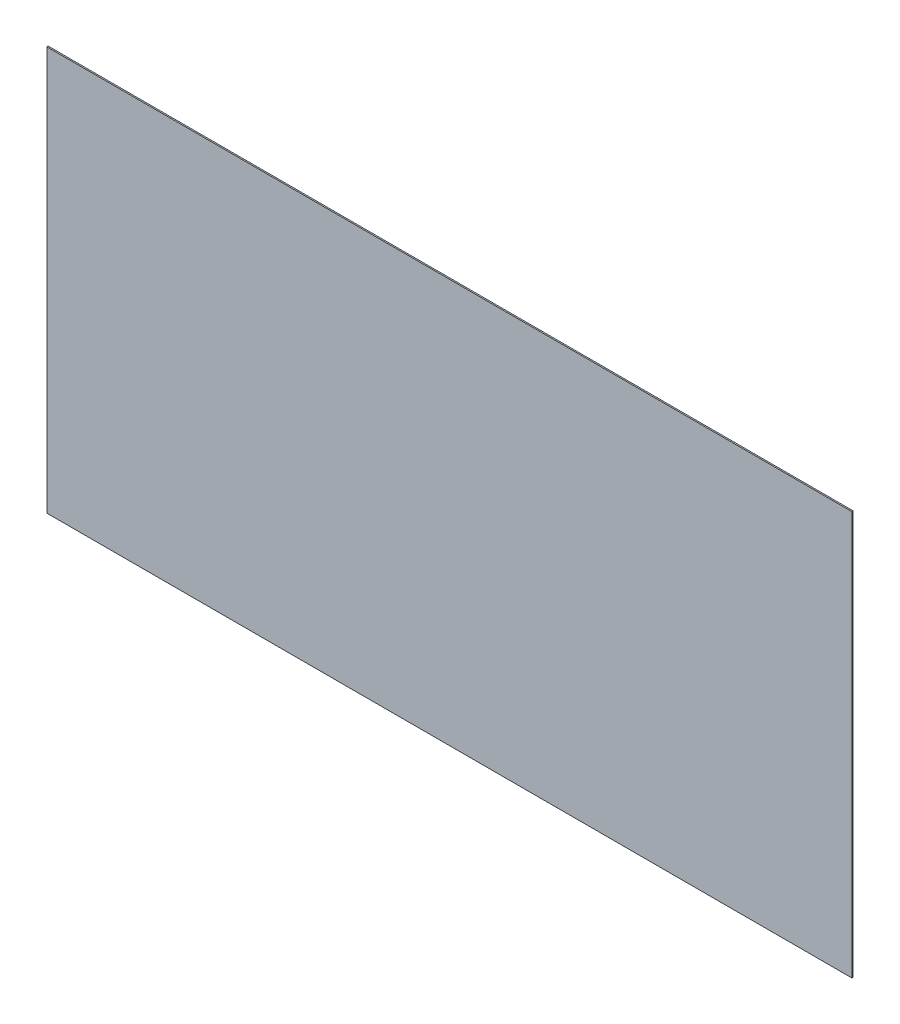
ISO-10303-21;
HEADER;
FILE_DESCRIPTION(('STEP AP214'),'2;1');
FILE_NAME('part.step','',(''),(''),'','','');
FILE_SCHEMA(('AUTOMOTIVE_DESIGN { 1 0 10303 214 1 1 1 1 }'));
ENDSEC;
DATA;
#1=APPLICATION_CONTEXT('core data for automotive mechanical design processes');
#2=APPLICATION_PROTOCOL_DEFINITION('international standard','automotive_design',2000,#1);
#3=PRODUCT_CONTEXT('',#1,'mechanical');
#4=PRODUCT('Part','Part','',(#3));
#5=PRODUCT_RELATED_PRODUCT_CATEGORY('part','',(#4));
#6=PRODUCT_DEFINITION_FORMATION('','',#4);
#7=PRODUCT_DEFINITION_CONTEXT('part definition',#1,'design');
#8=PRODUCT_DEFINITION('design','',#6,#7);
#9=PRODUCT_DEFINITION_SHAPE('','',#8);
#10=(LENGTH_UNIT() NAMED_UNIT(*) SI_UNIT(.MILLI.,.METRE.));
#11=(NAMED_UNIT(*) PLANE_ANGLE_UNIT() SI_UNIT($,.RADIAN.));
#12=(NAMED_UNIT(*) SI_UNIT($,.STERADIAN.) SOLID_ANGLE_UNIT());
#13=UNCERTAINTY_MEASURE_WITH_UNIT(LENGTH_MEASURE(1.E-05),#10,'distance_accuracy_value','');
#14=(GEOMETRIC_REPRESENTATION_CONTEXT(3) GLOBAL_UNCERTAINTY_ASSIGNED_CONTEXT((#13)) GLOBAL_UNIT_ASSIGNED_CONTEXT((#10,
#11,#12)) REPRESENTATION_CONTEXT('',''));
#15=CARTESIAN_POINT('',(0.,0.,0.));
#16=DIRECTION('',(0.,0.,1.));
#17=DIRECTION('',(1.,0.,0.));
#18=AXIS2_PLACEMENT_3D('',#15,#16,#17);
#19=CARTESIAN_POINT('',(0.,0.,1.));
#20=DIRECTION('',(1.,0.,0.));
#21=DIRECTION('',(0.,0.,-1.));
#22=AXIS2_PLACEMENT_3D('',#19,#20,#21);
#23=PLANE('',#22);
#24=DIRECTION('',(0.,-1.,0.));
#25=VECTOR('',#24,1.);
#26=CARTESIAN_POINT('',(0.,0.,0.));
#27=LINE('',#26,#25);
#28=CARTESIAN_POINT('',(0.,310.,0.));
#29=VERTEX_POINT('',#28);
#30=CARTESIAN_POINT('',(0.,0.,0.));
#31=VERTEX_POINT('',#30);
#32=EDGE_CURVE('E102',#29,#31,#27,.T.);
#33=ORIENTED_EDGE('',*,*,#32,.T.);
#34=DIRECTION('',(0.,0.,-1.));
#35=VECTOR('',#34,1.);
#36=CARTESIAN_POINT('',(0.,0.,1.));
#37=LINE('',#36,#35);
#38=CARTESIAN_POINT('',(0.,0.,1.));
#39=VERTEX_POINT('',#38);
#40=EDGE_CURVE('E11',#39,#31,#37,.T.);
#41=ORIENTED_EDGE('',*,*,#40,.F.);
#42=DIRECTION('',(0.,-1.,0.));
#43=VECTOR('',#42,1.);
#44=CARTESIAN_POINT('',(0.,0.,1.));
#45=LINE('',#44,#43);
#46=CARTESIAN_POINT('',(0.,310.,1.));
#47=VERTEX_POINT('',#46);
#48=EDGE_CURVE('E90',#47,#39,#45,.T.);
#49=ORIENTED_EDGE('',*,*,#48,.F.);
#50=DIRECTION('',(0.,0.,-1.));
#51=VECTOR('',#50,1.);
#52=CARTESIAN_POINT('',(0.,310.,1.));
#53=LINE('',#52,#51);
#54=EDGE_CURVE('E98',#47,#29,#53,.T.);
#55=ORIENTED_EDGE('',*,*,#54,.T.);
#56=EDGE_LOOP('',(#33,#41,#49,#55));
#57=FACE_BOUND('',#56,.T.);
#58=ADVANCED_FACE('F39',(#57),#23,.F.);
#59=CARTESIAN_POINT('',(0.,0.,1.));
#60=DIRECTION('',(0.,1.,0.));
#61=DIRECTION('',(0.,0.,1.));
#62=AXIS2_PLACEMENT_3D('',#59,#60,#61);
#63=PLANE('',#62);
#64=DIRECTION('',(1.,0.,0.));
#65=VECTOR('',#64,1.);
#66=CARTESIAN_POINT('',(0.,0.,0.));
#67=LINE('',#66,#65);
#68=CARTESIAN_POINT('',(618.,0.,0.));
#69=VERTEX_POINT('',#68);
#70=EDGE_CURVE('E94',#31,#69,#67,.T.);
#71=ORIENTED_EDGE('',*,*,#70,.T.);
#72=DIRECTION('',(0.,0.,-1.));
#73=VECTOR('',#72,1.);
#74=CARTESIAN_POINT('',(618.,0.,1.));
#75=LINE('',#74,#73);
#76=CARTESIAN_POINT('',(618.,0.,1.));
#77=VERTEX_POINT('',#76);
#78=EDGE_CURVE('E47',#77,#69,#75,.T.);
#79=ORIENTED_EDGE('',*,*,#78,.F.);
#80=DIRECTION('',(1.,0.,0.));
#81=VECTOR('',#80,1.);
#82=CARTESIAN_POINT('',(0.,0.,1.));
#83=LINE('',#82,#81);
#84=EDGE_CURVE('E85',#39,#77,#83,.T.);
#85=ORIENTED_EDGE('',*,*,#84,.F.);
#86=ORIENTED_EDGE('',*,*,#40,.T.);
#87=EDGE_LOOP('',(#71,#79,#85,#86));
#88=FACE_BOUND('',#87,.T.);
#89=ADVANCED_FACE('F93',(#88),#63,.F.);
#90=CARTESIAN_POINT('',(618.,0.,1.));
#91=DIRECTION('',(-1.,0.,0.));
#92=DIRECTION('',(0.,0.,1.));
#93=AXIS2_PLACEMENT_3D('',#90,#91,#92);
#94=PLANE('',#93);
#95=DIRECTION('',(0.,1.,0.));
#96=VECTOR('',#95,1.);
#97=CARTESIAN_POINT('',(618.,0.,0.));
#98=LINE('',#97,#96);
#99=CARTESIAN_POINT('',(618.,310.,0.));
#100=VERTEX_POINT('',#99);
#101=EDGE_CURVE('E72',#69,#100,#98,.T.);
#102=ORIENTED_EDGE('',*,*,#101,.T.);
#103=DIRECTION('',(0.,0.,-1.));
#104=VECTOR('',#103,1.);
#105=CARTESIAN_POINT('',(618.,310.,1.));
#106=LINE('',#105,#104);
#107=CARTESIAN_POINT('',(618.,310.,1.));
#108=VERTEX_POINT('',#107);
#109=EDGE_CURVE('E95',#108,#100,#106,.T.);
#110=ORIENTED_EDGE('',*,*,#109,.F.);
#111=DIRECTION('',(0.,1.,0.));
#112=VECTOR('',#111,1.);
#113=CARTESIAN_POINT('',(618.,0.,1.));
#114=LINE('',#113,#112);
#115=EDGE_CURVE('E88',#77,#108,#114,.T.);
#116=ORIENTED_EDGE('',*,*,#115,.F.);
#117=ORIENTED_EDGE('',*,*,#78,.T.);
#118=EDGE_LOOP('',(#102,#110,#116,#117));
#119=FACE_BOUND('',#118,.T.);
#120=ADVANCED_FACE('F96',(#119),#94,.F.);
#121=CARTESIAN_POINT('',(0.,310.,1.));
#122=DIRECTION('',(0.,-1.,0.));
#123=DIRECTION('',(0.,0.,-1.));
#124=AXIS2_PLACEMENT_3D('',#121,#122,#123);
#125=PLANE('',#124);
#126=DIRECTION('',(-1.,0.,0.));
#127=VECTOR('',#126,1.);
#128=CARTESIAN_POINT('',(0.,310.,0.));
#129=LINE('',#128,#127);
#130=EDGE_CURVE('E78',#100,#29,#129,.T.);
#131=ORIENTED_EDGE('',*,*,#130,.T.);
#132=ORIENTED_EDGE('',*,*,#54,.F.);
#133=DIRECTION('',(-1.,0.,0.));
#134=VECTOR('',#133,1.);
#135=CARTESIAN_POINT('',(0.,310.,1.));
#136=LINE('',#135,#134);
#137=EDGE_CURVE('E55',#108,#47,#136,.T.);
#138=ORIENTED_EDGE('',*,*,#137,.F.);
#139=ORIENTED_EDGE('',*,*,#109,.T.);
#140=EDGE_LOOP('',(#131,#132,#138,#139));
#141=FACE_BOUND('',#140,.T.);
#142=ADVANCED_FACE('F109',(#141),#125,.F.);
#143=CARTESIAN_POINT('',(0.,0.,1.));
#144=DIRECTION('',(0.,0.,-1.));
#145=DIRECTION('',(-1.,0.,0.));
#146=AXIS2_PLACEMENT_3D('',#143,#144,#145);
#147=PLANE('',#146);
#148=ORIENTED_EDGE('',*,*,#48,.T.);
#149=ORIENTED_EDGE('',*,*,#84,.T.);
#150=ORIENTED_EDGE('',*,*,#115,.T.);
#151=ORIENTED_EDGE('',*,*,#137,.T.);
#152=EDGE_LOOP('',(#148,#149,#150,#151));
#153=FACE_BOUND('',#152,.T.);
#154=ADVANCED_FACE('F86',(#153),#147,.F.);
#155=CARTESIAN_POINT('',(0.,0.,0.));
#156=DIRECTION('',(0.,0.,-1.));
#157=DIRECTION('',(-1.,0.,0.));
#158=AXIS2_PLACEMENT_3D('',#155,#156,#157);
#159=PLANE('',#158);
#160=ORIENTED_EDGE('',*,*,#32,.F.);
#161=ORIENTED_EDGE('',*,*,#130,.F.);
#162=ORIENTED_EDGE('',*,*,#101,.F.);
#163=ORIENTED_EDGE('',*,*,#70,.F.);
#164=EDGE_LOOP('',(#160,#161,#162,#163));
#165=FACE_BOUND('',#164,.T.);
#166=ADVANCED_FACE('F112',(#165),#159,.T.);
#167=CLOSED_SHELL('',(#58,#89,#120,#142,#154,#166));
#168=MANIFOLD_SOLID_BREP('B2',#167);
#169=ADVANCED_BREP_SHAPE_REPRESENTATION('',(#18,#168),#14);
#170=SHAPE_DEFINITION_REPRESENTATION(#9,#169);
ENDSEC;
END-ISO-10303-21;
